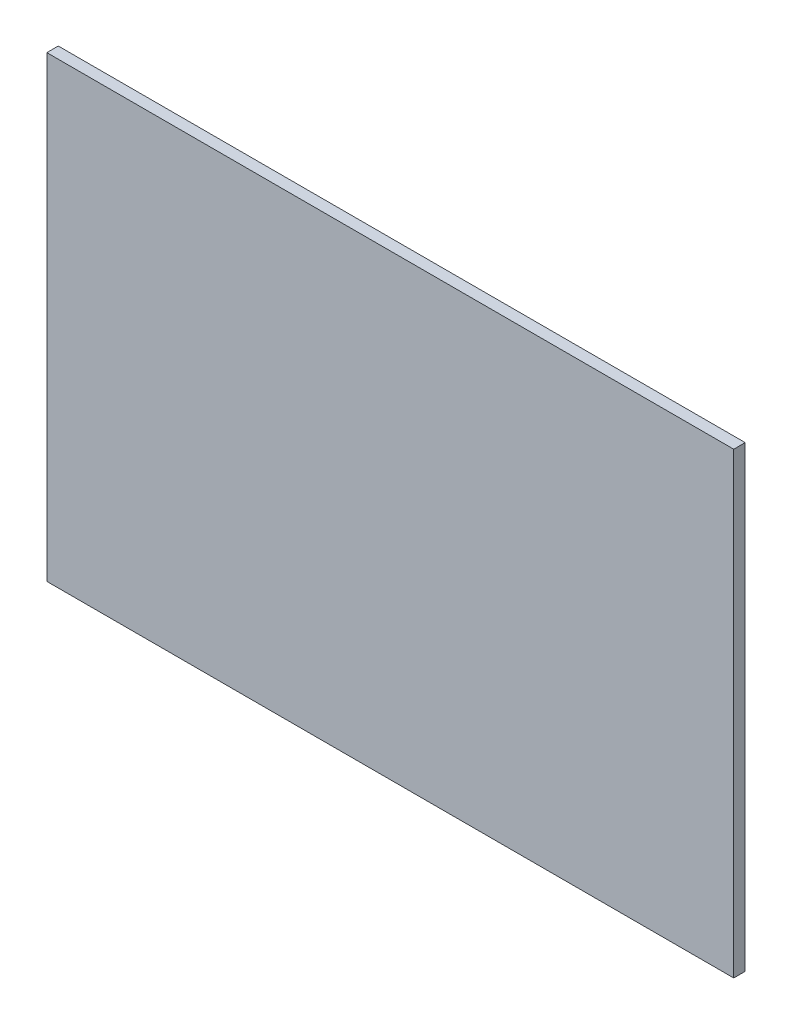
ISO-10303-21;
HEADER;
FILE_DESCRIPTION(('STEP AP214'),'2;1');
FILE_NAME('part.step','',(''),(''),'','','');
FILE_SCHEMA(('AUTOMOTIVE_DESIGN { 1 0 10303 214 1 1 1 1 }'));
ENDSEC;
DATA;
#1=APPLICATION_CONTEXT('core data for automotive mechanical design processes');
#2=APPLICATION_PROTOCOL_DEFINITION('international standard','automotive_design',2000,#1);
#3=PRODUCT_CONTEXT('',#1,'mechanical');
#4=PRODUCT('Part','Part','',(#3));
#5=PRODUCT_RELATED_PRODUCT_CATEGORY('part','',(#4));
#6=PRODUCT_DEFINITION_FORMATION('','',#4);
#7=PRODUCT_DEFINITION_CONTEXT('part definition',#1,'design');
#8=PRODUCT_DEFINITION('design','',#6,#7);
#9=PRODUCT_DEFINITION_SHAPE('','',#8);
#10=(LENGTH_UNIT() NAMED_UNIT(*) SI_UNIT(.MILLI.,.METRE.));
#11=(NAMED_UNIT(*) PLANE_ANGLE_UNIT() SI_UNIT($,.RADIAN.));
#12=(NAMED_UNIT(*) SI_UNIT($,.STERADIAN.) SOLID_ANGLE_UNIT());
#13=UNCERTAINTY_MEASURE_WITH_UNIT(LENGTH_MEASURE(1.E-05),#10,'distance_accuracy_value','');
#14=(GEOMETRIC_REPRESENTATION_CONTEXT(3) GLOBAL_UNCERTAINTY_ASSIGNED_CONTEXT((#13)) GLOBAL_UNIT_ASSIGNED_CONTEXT((#10,
#11,#12)) REPRESENTATION_CONTEXT('',''));
#15=CARTESIAN_POINT('',(0.,0.,0.));
#16=DIRECTION('',(0.,0.,1.));
#17=DIRECTION('',(1.,0.,0.));
#18=AXIS2_PLACEMENT_3D('',#15,#16,#17);
#19=CARTESIAN_POINT('',(240.,160.,8.));
#20=DIRECTION('',(-1.,0.,0.));
#21=DIRECTION('',(0.,0.,1.));
#22=AXIS2_PLACEMENT_3D('',#19,#20,#21);
#23=PLANE('',#22);
#24=DIRECTION('',(0.,1.,0.));
#25=VECTOR('',#24,1.);
#26=CARTESIAN_POINT('',(240.,160.,0.));
#27=LINE('',#26,#25);
#28=CARTESIAN_POINT('',(240.,-160.,0.));
#29=VERTEX_POINT('',#28);
#30=CARTESIAN_POINT('',(240.,160.,0.));
#31=VERTEX_POINT('',#30);
#32=EDGE_CURVE('E96',#29,#31,#27,.T.);
#33=ORIENTED_EDGE('',*,*,#32,.T.);
#34=DIRECTION('',(0.,0.,-1.));
#35=VECTOR('',#34,1.);
#36=CARTESIAN_POINT('',(240.,160.,8.));
#37=LINE('',#36,#35);
#38=CARTESIAN_POINT('',(240.,160.,8.));
#39=VERTEX_POINT('',#38);
#40=EDGE_CURVE('E11',#39,#31,#37,.T.);
#41=ORIENTED_EDGE('',*,*,#40,.F.);
#42=DIRECTION('',(0.,1.,0.));
#43=VECTOR('',#42,1.);
#44=CARTESIAN_POINT('',(240.,160.,8.));
#45=LINE('',#44,#43);
#46=CARTESIAN_POINT('',(240.,-160.,8.));
#47=VERTEX_POINT('',#46);
#48=EDGE_CURVE('E84',#47,#39,#45,.T.);
#49=ORIENTED_EDGE('',*,*,#48,.F.);
#50=DIRECTION('',(0.,0.,-1.));
#51=VECTOR('',#50,1.);
#52=CARTESIAN_POINT('',(240.,-160.,8.));
#53=LINE('',#52,#51);
#54=EDGE_CURVE('E92',#47,#29,#53,.T.);
#55=ORIENTED_EDGE('',*,*,#54,.T.);
#56=EDGE_LOOP('',(#33,#41,#49,#55));
#57=FACE_BOUND('',#56,.T.);
#58=ADVANCED_FACE('F33',(#57),#23,.F.);
#59=CARTESIAN_POINT('',(-240.,160.,8.));
#60=DIRECTION('',(0.,-1.,0.));
#61=DIRECTION('',(0.,0.,-1.));
#62=AXIS2_PLACEMENT_3D('',#59,#60,#61);
#63=PLANE('',#62);
#64=DIRECTION('',(-1.,0.,0.));
#65=VECTOR('',#64,1.);
#66=CARTESIAN_POINT('',(-240.,160.,0.));
#67=LINE('',#66,#65);
#68=CARTESIAN_POINT('',(-240.,160.,0.));
#69=VERTEX_POINT('',#68);
#70=EDGE_CURVE('E88',#31,#69,#67,.T.);
#71=ORIENTED_EDGE('',*,*,#70,.T.);
#72=DIRECTION('',(0.,0.,-1.));
#73=VECTOR('',#72,1.);
#74=CARTESIAN_POINT('',(-240.,160.,8.));
#75=LINE('',#74,#73);
#76=CARTESIAN_POINT('',(-240.,160.,8.));
#77=VERTEX_POINT('',#76);
#78=EDGE_CURVE('E41',#77,#69,#75,.T.);
#79=ORIENTED_EDGE('',*,*,#78,.F.);
#80=DIRECTION('',(-1.,0.,0.));
#81=VECTOR('',#80,1.);
#82=CARTESIAN_POINT('',(-240.,160.,8.));
#83=LINE('',#82,#81);
#84=EDGE_CURVE('E79',#39,#77,#83,.T.);
#85=ORIENTED_EDGE('',*,*,#84,.F.);
#86=ORIENTED_EDGE('',*,*,#40,.T.);
#87=EDGE_LOOP('',(#71,#79,#85,#86));
#88=FACE_BOUND('',#87,.T.);
#89=ADVANCED_FACE('F87',(#88),#63,.F.);
#90=CARTESIAN_POINT('',(-240.,160.,8.));
#91=DIRECTION('',(1.,0.,0.));
#92=DIRECTION('',(0.,1.,0.));
#93=AXIS2_PLACEMENT_3D('',#90,#91,#92);
#94=PLANE('',#93);
#95=DIRECTION('',(0.,-1.,0.));
#96=VECTOR('',#95,1.);
#97=CARTESIAN_POINT('',(-240.,160.,0.));
#98=LINE('',#97,#96);
#99=CARTESIAN_POINT('',(-240.,-160.,0.));
#100=VERTEX_POINT('',#99);
#101=EDGE_CURVE('E66',#69,#100,#98,.T.);
#102=ORIENTED_EDGE('',*,*,#101,.T.);
#103=DIRECTION('',(0.,0.,-1.));
#104=VECTOR('',#103,1.);
#105=CARTESIAN_POINT('',(-240.,-160.,8.));
#106=LINE('',#105,#104);
#107=CARTESIAN_POINT('',(-240.,-160.,8.));
#108=VERTEX_POINT('',#107);
#109=EDGE_CURVE('E89',#108,#100,#106,.T.);
#110=ORIENTED_EDGE('',*,*,#109,.F.);
#111=DIRECTION('',(0.,-1.,0.));
#112=VECTOR('',#111,1.);
#113=CARTESIAN_POINT('',(-240.,160.,8.));
#114=LINE('',#113,#112);
#115=EDGE_CURVE('E82',#77,#108,#114,.T.);
#116=ORIENTED_EDGE('',*,*,#115,.F.);
#117=ORIENTED_EDGE('',*,*,#78,.T.);
#118=EDGE_LOOP('',(#102,#110,#116,#117));
#119=FACE_BOUND('',#118,.T.);
#120=ADVANCED_FACE('F90',(#119),#94,.F.);
#121=CARTESIAN_POINT('',(-240.,-160.,8.));
#122=DIRECTION('',(0.,1.,0.));
#123=DIRECTION('',(0.,0.,1.));
#124=AXIS2_PLACEMENT_3D('',#121,#122,#123);
#125=PLANE('',#124);
#126=DIRECTION('',(1.,0.,0.));
#127=VECTOR('',#126,1.);
#128=CARTESIAN_POINT('',(-240.,-160.,0.));
#129=LINE('',#128,#127);
#130=EDGE_CURVE('E72',#100,#29,#129,.T.);
#131=ORIENTED_EDGE('',*,*,#130,.T.);
#132=ORIENTED_EDGE('',*,*,#54,.F.);
#133=DIRECTION('',(1.,0.,0.));
#134=VECTOR('',#133,1.);
#135=CARTESIAN_POINT('',(-240.,-160.,8.));
#136=LINE('',#135,#134);
#137=EDGE_CURVE('E49',#108,#47,#136,.T.);
#138=ORIENTED_EDGE('',*,*,#137,.F.);
#139=ORIENTED_EDGE('',*,*,#109,.T.);
#140=EDGE_LOOP('',(#131,#132,#138,#139));
#141=FACE_BOUND('',#140,.T.);
#142=ADVANCED_FACE('F103',(#141),#125,.F.);
#143=CARTESIAN_POINT('',(0.,0.,8.));
#144=DIRECTION('',(0.,0.,1.));
#145=DIRECTION('',(1.,0.,0.));
#146=AXIS2_PLACEMENT_3D('',#143,#144,#145);
#147=PLANE('',#146);
#148=ORIENTED_EDGE('',*,*,#48,.T.);
#149=ORIENTED_EDGE('',*,*,#84,.T.);
#150=ORIENTED_EDGE('',*,*,#115,.T.);
#151=ORIENTED_EDGE('',*,*,#137,.T.);
#152=EDGE_LOOP('',(#148,#149,#150,#151));
#153=FACE_BOUND('',#152,.T.);
#154=ADVANCED_FACE('F80',(#153),#147,.T.);
#155=CARTESIAN_POINT('',(0.,0.,0.));
#156=DIRECTION('',(0.,0.,1.));
#157=DIRECTION('',(1.,0.,0.));
#158=AXIS2_PLACEMENT_3D('',#155,#156,#157);
#159=PLANE('',#158);
#160=ORIENTED_EDGE('',*,*,#32,.F.);
#161=ORIENTED_EDGE('',*,*,#130,.F.);
#162=ORIENTED_EDGE('',*,*,#101,.F.);
#163=ORIENTED_EDGE('',*,*,#70,.F.);
#164=EDGE_LOOP('',(#160,#161,#162,#163));
#165=FACE_BOUND('',#164,.T.);
#166=ADVANCED_FACE('F106',(#165),#159,.F.);
#167=CLOSED_SHELL('',(#58,#89,#120,#142,#154,#166));
#168=MANIFOLD_SOLID_BREP('B2',#167);
#169=ADVANCED_BREP_SHAPE_REPRESENTATION('',(#18,#168),#14);
#170=SHAPE_DEFINITION_REPRESENTATION(#9,#169);
ENDSEC;
END-ISO-10303-21;
